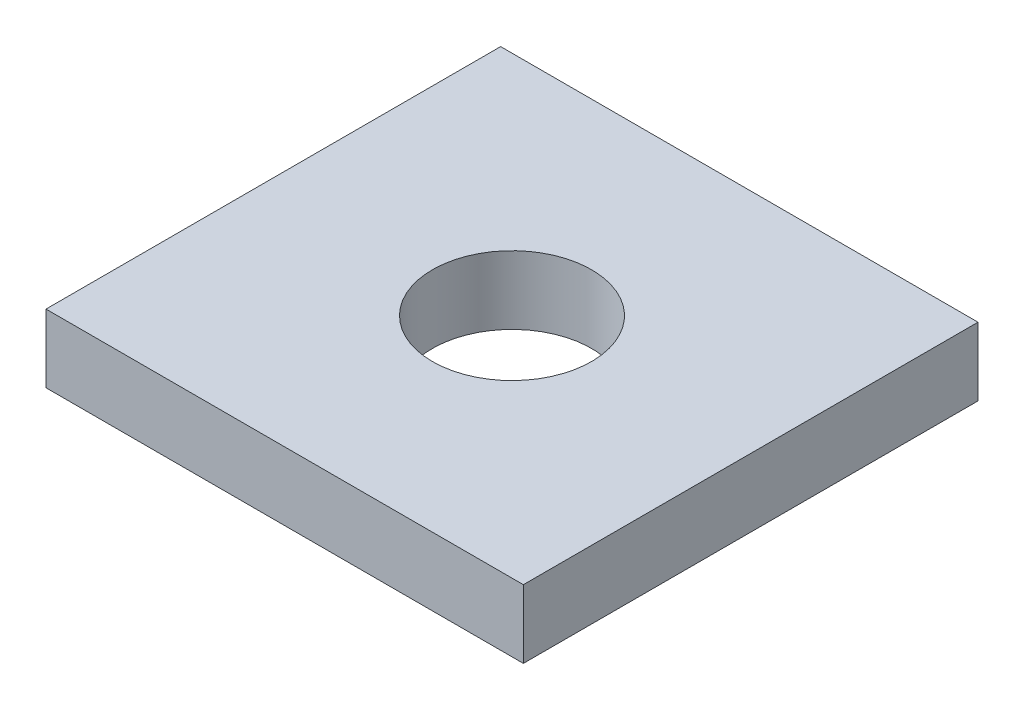
ISO-10303-21;
HEADER;
FILE_DESCRIPTION(('STEP AP214'),'2;1');
FILE_NAME('part.step','',(''),(''),'','','');
FILE_SCHEMA(('AUTOMOTIVE_DESIGN { 1 0 10303 214 1 1 1 1 }'));
ENDSEC;
DATA;
#1=APPLICATION_CONTEXT('core data for automotive mechanical design processes');
#2=APPLICATION_PROTOCOL_DEFINITION('international standard','automotive_design',2000,#1);
#3=PRODUCT_CONTEXT('',#1,'mechanical');
#4=PRODUCT('Part','Part','',(#3));
#5=PRODUCT_RELATED_PRODUCT_CATEGORY('part','',(#4));
#6=PRODUCT_DEFINITION_FORMATION('','',#4);
#7=PRODUCT_DEFINITION_CONTEXT('part definition',#1,'design');
#8=PRODUCT_DEFINITION('design','',#6,#7);
#9=PRODUCT_DEFINITION_SHAPE('','',#8);
#10=(LENGTH_UNIT() NAMED_UNIT(*) SI_UNIT(.MILLI.,.METRE.));
#11=(NAMED_UNIT(*) PLANE_ANGLE_UNIT() SI_UNIT($,.RADIAN.));
#12=(NAMED_UNIT(*) SI_UNIT($,.STERADIAN.) SOLID_ANGLE_UNIT());
#13=UNCERTAINTY_MEASURE_WITH_UNIT(LENGTH_MEASURE(1.E-05),#10,'distance_accuracy_value','');
#14=(GEOMETRIC_REPRESENTATION_CONTEXT(3) GLOBAL_UNCERTAINTY_ASSIGNED_CONTEXT((#13)) GLOBAL_UNIT_ASSIGNED_CONTEXT((#10,
#11,#12)) REPRESENTATION_CONTEXT('',''));
#15=CARTESIAN_POINT('',(0.,0.,0.));
#16=DIRECTION('',(0.,0.,1.));
#17=DIRECTION('',(1.,0.,0.));
#18=AXIS2_PLACEMENT_3D('',#15,#16,#17);
#19=CARTESIAN_POINT('',(21.,6.,-20.));
#20=DIRECTION('',(-1.,0.,0.));
#21=DIRECTION('',(0.,0.,1.));
#22=AXIS2_PLACEMENT_3D('',#19,#20,#21);
#23=PLANE('',#22);
#24=DIRECTION('',(0.,0.,-1.));
#25=VECTOR('',#24,1.);
#26=CARTESIAN_POINT('',(21.,0.,-20.));
#27=LINE('',#26,#25);
#28=CARTESIAN_POINT('',(21.,0.,20.));
#29=VERTEX_POINT('',#28);
#30=CARTESIAN_POINT('',(21.,0.,-20.));
#31=VERTEX_POINT('',#30);
#32=EDGE_CURVE('E98',#29,#31,#27,.T.);
#33=ORIENTED_EDGE('',*,*,#32,.T.);
#34=DIRECTION('',(0.,-1.,0.));
#35=VECTOR('',#34,1.);
#36=CARTESIAN_POINT('',(21.,6.,-20.));
#37=LINE('',#36,#35);
#38=CARTESIAN_POINT('',(21.,6.,-20.));
#39=VERTEX_POINT('',#38);
#40=EDGE_CURVE('E11',#39,#31,#37,.T.);
#41=ORIENTED_EDGE('',*,*,#40,.F.);
#42=DIRECTION('',(0.,0.,-1.));
#43=VECTOR('',#42,1.);
#44=CARTESIAN_POINT('',(21.,6.,-20.));
#45=LINE('',#44,#43);
#46=CARTESIAN_POINT('',(21.,6.,20.));
#47=VERTEX_POINT('',#46);
#48=EDGE_CURVE('E85',#47,#39,#45,.T.);
#49=ORIENTED_EDGE('',*,*,#48,.F.);
#50=DIRECTION('',(0.,-1.,0.));
#51=VECTOR('',#50,1.);
#52=CARTESIAN_POINT('',(21.,6.,20.));
#53=LINE('',#52,#51);
#54=EDGE_CURVE('E94',#47,#29,#53,.T.);
#55=ORIENTED_EDGE('',*,*,#54,.T.);
#56=EDGE_LOOP('',(#33,#41,#49,#55));
#57=FACE_BOUND('',#56,.T.);
#58=ADVANCED_FACE('F33',(#57),#23,.F.);
#59=CARTESIAN_POINT('',(-21.,6.,-20.));
#60=DIRECTION('',(0.,0.,1.));
#61=DIRECTION('',(1.,0.,0.));
#62=AXIS2_PLACEMENT_3D('',#59,#60,#61);
#63=PLANE('',#62);
#64=DIRECTION('',(-1.,0.,0.));
#65=VECTOR('',#64,1.);
#66=CARTESIAN_POINT('',(-21.,0.,-20.));
#67=LINE('',#66,#65);
#68=CARTESIAN_POINT('',(-21.,0.,-20.));
#69=VERTEX_POINT('',#68);
#70=EDGE_CURVE('E89',#31,#69,#67,.T.);
#71=ORIENTED_EDGE('',*,*,#70,.T.);
#72=DIRECTION('',(0.,-1.,0.));
#73=VECTOR('',#72,1.);
#74=CARTESIAN_POINT('',(-21.,6.,-20.));
#75=LINE('',#74,#73);
#76=CARTESIAN_POINT('',(-21.,6.,-20.));
#77=VERTEX_POINT('',#76);
#78=EDGE_CURVE('E42',#77,#69,#75,.T.);
#79=ORIENTED_EDGE('',*,*,#78,.F.);
#80=DIRECTION('',(-1.,0.,0.));
#81=VECTOR('',#80,1.);
#82=CARTESIAN_POINT('',(-21.,6.,-20.));
#83=LINE('',#82,#81);
#84=EDGE_CURVE('E80',#39,#77,#83,.T.);
#85=ORIENTED_EDGE('',*,*,#84,.F.);
#86=ORIENTED_EDGE('',*,*,#40,.T.);
#87=EDGE_LOOP('',(#71,#79,#85,#86));
#88=FACE_BOUND('',#87,.T.);
#89=ADVANCED_FACE('F88',(#88),#63,.F.);
#90=CARTESIAN_POINT('',(-21.,6.,-20.));
#91=DIRECTION('',(1.,0.,0.));
#92=DIRECTION('',(0.,0.,-1.));
#93=AXIS2_PLACEMENT_3D('',#90,#91,#92);
#94=PLANE('',#93);
#95=DIRECTION('',(0.,0.,1.));
#96=VECTOR('',#95,1.);
#97=CARTESIAN_POINT('',(-21.,0.,-20.));
#98=LINE('',#97,#96);
#99=CARTESIAN_POINT('',(-21.,0.,20.));
#100=VERTEX_POINT('',#99);
#101=EDGE_CURVE('E67',#69,#100,#98,.T.);
#102=ORIENTED_EDGE('',*,*,#101,.T.);
#103=DIRECTION('',(0.,-1.,0.));
#104=VECTOR('',#103,1.);
#105=CARTESIAN_POINT('',(-21.,6.,20.));
#106=LINE('',#105,#104);
#107=CARTESIAN_POINT('',(-21.,6.,20.));
#108=VERTEX_POINT('',#107);
#109=EDGE_CURVE('E90',#108,#100,#106,.T.);
#110=ORIENTED_EDGE('',*,*,#109,.F.);
#111=DIRECTION('',(0.,0.,1.));
#112=VECTOR('',#111,1.);
#113=CARTESIAN_POINT('',(-21.,6.,-20.));
#114=LINE('',#113,#112);
#115=EDGE_CURVE('E83',#77,#108,#114,.T.);
#116=ORIENTED_EDGE('',*,*,#115,.F.);
#117=ORIENTED_EDGE('',*,*,#78,.T.);
#118=EDGE_LOOP('',(#102,#110,#116,#117));
#119=FACE_BOUND('',#118,.T.);
#120=ADVANCED_FACE('F92',(#119),#94,.F.);
#121=CARTESIAN_POINT('',(-21.,6.,20.));
#122=DIRECTION('',(0.,0.,-1.));
#123=DIRECTION('',(-1.,0.,0.));
#124=AXIS2_PLACEMENT_3D('',#121,#122,#123);
#125=PLANE('',#124);
#126=DIRECTION('',(1.,0.,0.));
#127=VECTOR('',#126,1.);
#128=CARTESIAN_POINT('',(-21.,0.,20.));
#129=LINE('',#128,#127);
#130=EDGE_CURVE('E73',#100,#29,#129,.T.);
#131=ORIENTED_EDGE('',*,*,#130,.T.);
#132=ORIENTED_EDGE('',*,*,#54,.F.);
#133=DIRECTION('',(1.,0.,0.));
#134=VECTOR('',#133,1.);
#135=CARTESIAN_POINT('',(-21.,6.,20.));
#136=LINE('',#135,#134);
#137=EDGE_CURVE('E50',#108,#47,#136,.T.);
#138=ORIENTED_EDGE('',*,*,#137,.F.);
#139=ORIENTED_EDGE('',*,*,#109,.T.);
#140=EDGE_LOOP('',(#131,#132,#138,#139));
#141=FACE_BOUND('',#140,.T.);
#142=ADVANCED_FACE('F105',(#141),#125,.F.);
#143=CARTESIAN_POINT('',(0.,6.,0.));
#144=DIRECTION('',(0.,1.,0.));
#145=DIRECTION('',(0.,0.,1.));
#146=AXIS2_PLACEMENT_3D('',#143,#144,#145);
#147=PLANE('',#146);
#148=CARTESIAN_POINT('',(0.,6.,0.));
#149=DIRECTION('',(0.,1.,0.));
#150=DIRECTION('',(0.,0.,1.));
#151=AXIS2_PLACEMENT_3D('',#148,#149,#150);
#152=CIRCLE('',#151,7.);
#153=CARTESIAN_POINT('',(0.,6.,7.));
#154=VERTEX_POINT('',#153);
#155=EDGE_CURVE('E111',#154,#154,#152,.T.);
#156=ORIENTED_EDGE('',*,*,#155,.F.);
#157=EDGE_LOOP('',(#156));
#158=FACE_BOUND('',#157,.T.);
#159=ORIENTED_EDGE('',*,*,#48,.T.);
#160=ORIENTED_EDGE('',*,*,#84,.T.);
#161=ORIENTED_EDGE('',*,*,#115,.T.);
#162=ORIENTED_EDGE('',*,*,#137,.T.);
#163=EDGE_LOOP('',(#159,#160,#161,#162));
#164=FACE_BOUND('',#163,.T.);
#165=ADVANCED_FACE('F81',(#158,#164),#147,.T.);
#166=CARTESIAN_POINT('',(0.,0.,0.));
#167=DIRECTION('',(0.,1.,0.));
#168=DIRECTION('',(0.,0.,1.));
#169=AXIS2_PLACEMENT_3D('',#166,#167,#168);
#170=PLANE('',#169);
#171=CARTESIAN_POINT('',(0.,0.,0.));
#172=DIRECTION('',(0.,1.,0.));
#173=DIRECTION('',(0.,0.,1.));
#174=AXIS2_PLACEMENT_3D('',#171,#172,#173);
#175=CIRCLE('',#174,7.);
#176=CARTESIAN_POINT('',(0.,0.,7.));
#177=VERTEX_POINT('',#176);
#178=EDGE_CURVE('E36',#177,#177,#175,.T.);
#179=ORIENTED_EDGE('',*,*,#178,.T.);
#180=EDGE_LOOP('',(#179));
#181=FACE_BOUND('',#180,.T.);
#182=ORIENTED_EDGE('',*,*,#32,.F.);
#183=ORIENTED_EDGE('',*,*,#130,.F.);
#184=ORIENTED_EDGE('',*,*,#101,.F.);
#185=ORIENTED_EDGE('',*,*,#70,.F.);
#186=EDGE_LOOP('',(#182,#183,#184,#185));
#187=FACE_BOUND('',#186,.T.);
#188=ADVANCED_FACE('F108',(#181,#187),#170,.F.);
#189=CARTESIAN_POINT('',(0.,-4.,0.));
#190=DIRECTION('',(0.,1.,0.));
#191=DIRECTION('',(0.,0.,1.));
#192=AXIS2_PLACEMENT_3D('',#189,#190,#191);
#193=CYLINDRICAL_SURFACE('',#192,7.);
#194=ORIENTED_EDGE('',*,*,#155,.T.);
#195=EDGE_LOOP('',(#194));
#196=FACE_BOUND('',#195,.T.);
#197=ORIENTED_EDGE('',*,*,#178,.F.);
#198=EDGE_LOOP('',(#197));
#199=FACE_BOUND('',#198,.T.);
#200=ADVANCED_FACE('F119',(#196,#199),#193,.F.);
#201=CLOSED_SHELL('',(#58,#89,#120,#142,#165,#188,#200));
#202=MANIFOLD_SOLID_BREP('B2',#201);
#203=ADVANCED_BREP_SHAPE_REPRESENTATION('',(#18,#202),#14);
#204=SHAPE_DEFINITION_REPRESENTATION(#9,#203);
ENDSEC;
END-ISO-10303-21;
